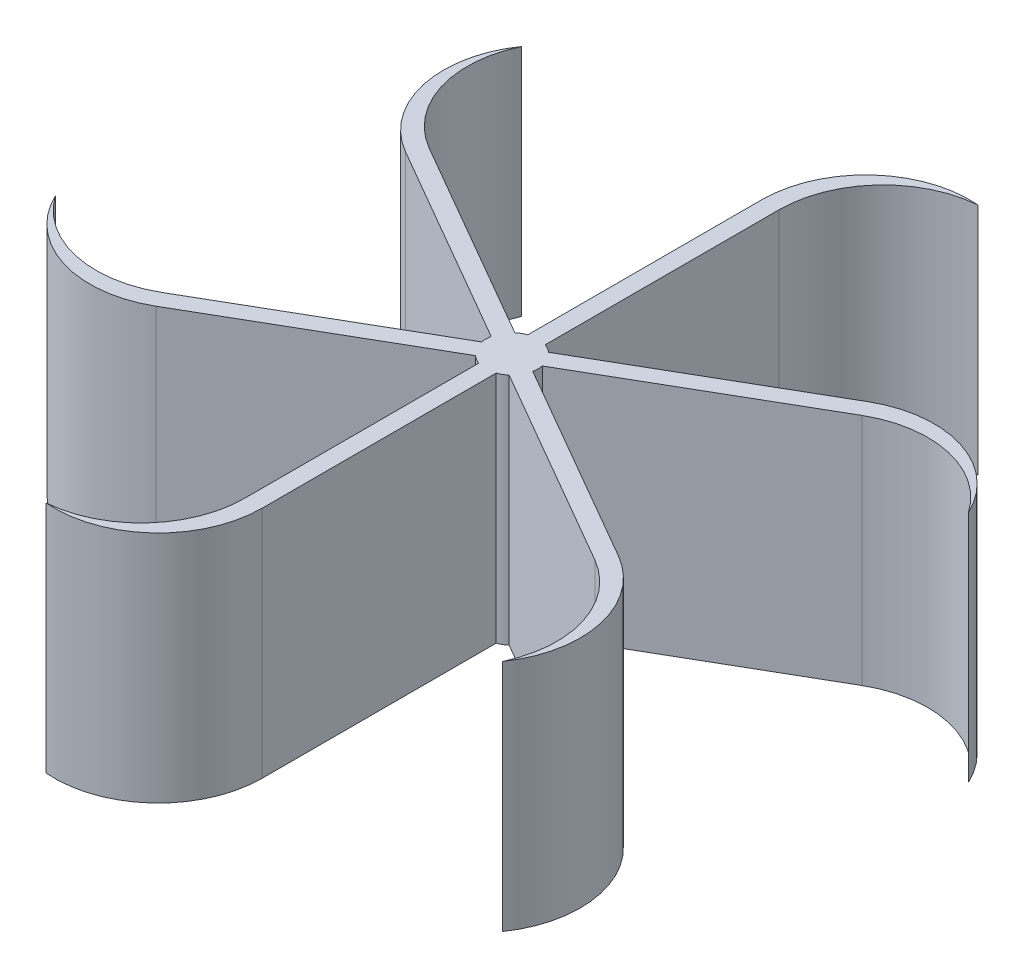
ISO-10303-21;
HEADER;
FILE_DESCRIPTION(('STEP AP214'),'2;1');
FILE_NAME('part.step','',(''),(''),'','','');
FILE_SCHEMA(('AUTOMOTIVE_DESIGN { 1 0 10303 214 1 1 1 1 }'));
ENDSEC;
DATA;
#1=APPLICATION_CONTEXT('core data for automotive mechanical design processes');
#2=APPLICATION_PROTOCOL_DEFINITION('international standard','automotive_design',2000,#1);
#3=PRODUCT_CONTEXT('',#1,'mechanical');
#4=PRODUCT('Part','Part','',(#3));
#5=PRODUCT_RELATED_PRODUCT_CATEGORY('part','',(#4));
#6=PRODUCT_DEFINITION_FORMATION('','',#4);
#7=PRODUCT_DEFINITION_CONTEXT('part definition',#1,'design');
#8=PRODUCT_DEFINITION('design','',#6,#7);
#9=PRODUCT_DEFINITION_SHAPE('','',#8);
#10=(LENGTH_UNIT() NAMED_UNIT(*) SI_UNIT(.MILLI.,.METRE.));
#11=(NAMED_UNIT(*) PLANE_ANGLE_UNIT() SI_UNIT($,.RADIAN.));
#12=(NAMED_UNIT(*) SI_UNIT($,.STERADIAN.) SOLID_ANGLE_UNIT());
#13=UNCERTAINTY_MEASURE_WITH_UNIT(LENGTH_MEASURE(1.E-05),#10,'distance_accuracy_value','');
#14=(GEOMETRIC_REPRESENTATION_CONTEXT(3) GLOBAL_UNCERTAINTY_ASSIGNED_CONTEXT((#13)) GLOBAL_UNIT_ASSIGNED_CONTEXT((#10,
#11,#12)) REPRESENTATION_CONTEXT('',''));
#15=CARTESIAN_POINT('',(0.,0.,0.));
#16=DIRECTION('',(0.,0.,1.));
#17=DIRECTION('',(1.,0.,0.));
#18=AXIS2_PLACEMENT_3D('',#15,#16,#17);
#19=CARTESIAN_POINT('',(0.,27.,0.));
#20=DIRECTION('',(0.,-1.,0.));
#21=DIRECTION('',(0.,0.,-1.));
#22=AXIS2_PLACEMENT_3D('',#19,#20,#21);
#23=CYLINDRICAL_SURFACE('',#22,3.00000000000001);
#24=CARTESIAN_POINT('',(0.,0.,0.));
#25=DIRECTION('',(0.,1.,0.));
#26=DIRECTION('',(0.,0.,1.));
#27=AXIS2_PLACEMENT_3D('',#24,#25,#26);
#28=CIRCLE('',#27,3.00000000000001);
#29=CARTESIAN_POINT('',(-1.,0.,-2.82842712474619));
#30=VERTEX_POINT('',#29);
#31=CARTESIAN_POINT('',(-1.94948974278315,0.,-2.28023896615756));
#32=VERTEX_POINT('',#31);
#33=EDGE_CURVE('E151',#30,#32,#28,.T.);
#34=ORIENTED_EDGE('',*,*,#33,.T.);
#35=DIRECTION('',(0.,-1.,0.));
#36=VECTOR('',#35,1.);
#37=CARTESIAN_POINT('',(-1.94948974278315,27.,-2.28023896615756));
#38=LINE('',#37,#36);
#39=CARTESIAN_POINT('',(-1.94948974278315,27.,-2.28023896615756));
#40=VERTEX_POINT('',#39);
#41=EDGE_CURVE('E11',#40,#32,#38,.T.);
#42=ORIENTED_EDGE('',*,*,#41,.F.);
#43=CARTESIAN_POINT('',(0.,27.,0.));
#44=DIRECTION('',(0.,1.,0.));
#45=DIRECTION('',(0.,0.,1.));
#46=AXIS2_PLACEMENT_3D('',#43,#44,#45);
#47=CIRCLE('',#46,3.00000000000001);
#48=CARTESIAN_POINT('',(-1.,27.,-2.82842712474619));
#49=VERTEX_POINT('',#48);
#50=EDGE_CURVE('E157',#49,#40,#47,.T.);
#51=ORIENTED_EDGE('',*,*,#50,.F.);
#52=DIRECTION('',(0.,-1.,0.));
#53=VECTOR('',#52,1.);
#54=CARTESIAN_POINT('',(-1.,27.,-2.82842712474619));
#55=LINE('',#54,#53);
#56=EDGE_CURVE('E257',#49,#30,#55,.T.);
#57=ORIENTED_EDGE('',*,*,#56,.T.);
#58=EDGE_LOOP('',(#34,#42,#51,#57));
#59=FACE_BOUND('',#58,.T.);
#60=ADVANCED_FACE('F33',(#59),#23,.T.);
#61=CARTESIAN_POINT('',(-1.94948974278315,27.,-2.28023896615756));
#62=DIRECTION('',(-0.50000000000001,0.,0.866025403784433));
#63=DIRECTION('',(0.866025403784433,0.,0.50000000000001));
#64=AXIS2_PLACEMENT_3D('',#61,#62,#63);
#65=PLANE('',#64);
#66=DIRECTION('',(-0.866025403784433,0.,-0.50000000000001));
#67=VECTOR('',#66,1.);
#68=CARTESIAN_POINT('',(-1.94948974278315,0.,-2.28023896615756));
#69=LINE('',#68,#67);
#70=CARTESIAN_POINT('',(-25.3321756449628,0.,-15.7802389661578));
#71=VERTEX_POINT('',#70);
#72=EDGE_CURVE('E262',#32,#71,#69,.T.);
#73=ORIENTED_EDGE('',*,*,#72,.T.);
#74=DIRECTION('',(0.,-1.,0.));
#75=VECTOR('',#74,1.);
#76=CARTESIAN_POINT('',(-25.3321756449628,27.,-15.7802389661578));
#77=LINE('',#76,#75);
#78=CARTESIAN_POINT('',(-25.3321756449628,27.,-15.7802389661578));
#79=VERTEX_POINT('',#78);
#80=EDGE_CURVE('E41',#79,#71,#77,.T.);
#81=ORIENTED_EDGE('',*,*,#80,.F.);
#82=DIRECTION('',(-0.866025403784433,0.,-0.50000000000001));
#83=VECTOR('',#82,1.);
#84=CARTESIAN_POINT('',(-1.94948974278315,27.,-2.28023896615756));
#85=LINE('',#84,#83);
#86=EDGE_CURVE('E479',#40,#79,#85,.T.);
#87=ORIENTED_EDGE('',*,*,#86,.F.);
#88=ORIENTED_EDGE('',*,*,#41,.T.);
#89=EDGE_LOOP('',(#73,#81,#87,#88));
#90=FACE_BOUND('',#89,.T.);
#91=ADVANCED_FACE('F482',(#90),#65,.F.);
#92=CARTESIAN_POINT('',(-19.3321756449627,27.,-26.172543811571));
#93=DIRECTION('',(0.,-1.,0.));
#94=DIRECTION('',(0.,0.,-1.));
#95=AXIS2_PLACEMENT_3D('',#92,#93,#94);
#96=CYLINDRICAL_SURFACE('',#95,12.);
#97=CARTESIAN_POINT('',(-19.3321756449627,0.,-26.172543811571));
#98=DIRECTION('',(0.,-1.,0.));
#99=DIRECTION('',(0.,0.,-1.));
#100=AXIS2_PLACEMENT_3D('',#97,#98,#99);
#101=CIRCLE('',#100,12.);
#102=CARTESIAN_POINT('',(-30.1883332335666,0.,-31.2856487793374));
#103=VERTEX_POINT('',#102);
#104=EDGE_CURVE('E264',#71,#103,#101,.T.);
#105=ORIENTED_EDGE('',*,*,#104,.T.);
#106=DIRECTION('',(0.,-1.,0.));
#107=VECTOR('',#106,1.);
#108=CARTESIAN_POINT('',(-30.1883332335666,27.,-31.2856487793374));
#109=LINE('',#108,#107);
#110=CARTESIAN_POINT('',(-30.1883332335666,27.,-31.2856487793374));
#111=VERTEX_POINT('',#110);
#112=EDGE_CURVE('E396',#111,#103,#109,.T.);
#113=ORIENTED_EDGE('',*,*,#112,.F.);
#114=CARTESIAN_POINT('',(-19.3321756449627,27.,-26.172543811571));
#115=DIRECTION('',(0.,-1.,0.));
#116=DIRECTION('',(0.,0.,-1.));
#117=AXIS2_PLACEMENT_3D('',#114,#115,#116);
#118=CIRCLE('',#117,12.);
#119=EDGE_CURVE('E405',#79,#111,#118,.T.);
#120=ORIENTED_EDGE('',*,*,#119,.F.);
#121=ORIENTED_EDGE('',*,*,#80,.T.);
#122=EDGE_LOOP('',(#105,#113,#120,#121));
#123=FACE_BOUND('',#122,.T.);
#124=ADVANCED_FACE('F403',(#123),#96,.F.);
#125=CARTESIAN_POINT('',(-20.3321756449627,27.,-24.4404930040022));
#126=DIRECTION('',(0.,-1.,0.));
#127=DIRECTION('',(0.,0.,-1.));
#128=AXIS2_PLACEMENT_3D('',#125,#126,#127);
#129=CYLINDRICAL_SURFACE('',#128,12.);
#130=CARTESIAN_POINT('',(-20.3321756449627,0.,-24.4404930040022));
#131=DIRECTION('',(0.,1.,0.));
#132=DIRECTION('',(0.,0.,-1.));
#133=AXIS2_PLACEMENT_3D('',#130,#131,#132);
#134=CIRCLE('',#133,12.);
#135=CARTESIAN_POINT('',(-26.3321756449629,0.,-14.048188158589));
#136=VERTEX_POINT('',#135);
#137=EDGE_CURVE('E266',#103,#136,#134,.T.);
#138=ORIENTED_EDGE('',*,*,#137,.T.);
#139=DIRECTION('',(0.,-1.,0.));
#140=VECTOR('',#139,1.);
#141=CARTESIAN_POINT('',(-26.3321756449629,27.,-14.048188158589));
#142=LINE('',#141,#140);
#143=CARTESIAN_POINT('',(-26.3321756449629,27.,-14.048188158589));
#144=VERTEX_POINT('',#143);
#145=EDGE_CURVE('E393',#144,#136,#142,.T.);
#146=ORIENTED_EDGE('',*,*,#145,.F.);
#147=CARTESIAN_POINT('',(-20.3321756449627,27.,-24.4404930040022));
#148=DIRECTION('',(0.,1.,0.));
#149=DIRECTION('',(0.,0.,-1.));
#150=AXIS2_PLACEMENT_3D('',#147,#148,#149);
#151=CIRCLE('',#150,12.);
#152=EDGE_CURVE('E422',#111,#144,#151,.T.);
#153=ORIENTED_EDGE('',*,*,#152,.F.);
#154=ORIENTED_EDGE('',*,*,#112,.T.);
#155=EDGE_LOOP('',(#138,#146,#153,#154));
#156=FACE_BOUND('',#155,.T.);
#157=ADVANCED_FACE('F413',(#156),#129,.T.);
#158=CARTESIAN_POINT('',(-2.94948974278317,27.,-0.548188158588691));
#159=DIRECTION('',(0.50000000000001,0.,-0.866025403784433));
#160=DIRECTION('',(-0.866025403784433,0.,-0.50000000000001));
#161=AXIS2_PLACEMENT_3D('',#158,#159,#160);
#162=PLANE('',#161);
#163=DIRECTION('',(0.866025403784433,0.,0.50000000000001));
#164=VECTOR('',#163,1.);
#165=CARTESIAN_POINT('',(-2.94948974278317,0.,-0.548188158588691));
#166=LINE('',#165,#164);
#167=CARTESIAN_POINT('',(-2.94948974278317,0.,-0.548188158588692));
#168=VERTEX_POINT('',#167);
#169=EDGE_CURVE('E268',#136,#168,#166,.T.);
#170=ORIENTED_EDGE('',*,*,#169,.T.);
#171=DIRECTION('',(0.,-1.,0.));
#172=VECTOR('',#171,1.);
#173=CARTESIAN_POINT('',(-2.94948974278317,27.,-0.548188158588692));
#174=LINE('',#173,#172);
#175=CARTESIAN_POINT('',(-2.94948974278317,27.,-0.548188158588692));
#176=VERTEX_POINT('',#175);
#177=EDGE_CURVE('E390',#176,#168,#174,.T.);
#178=ORIENTED_EDGE('',*,*,#177,.F.);
#179=DIRECTION('',(0.866025403784433,0.,0.50000000000001));
#180=VECTOR('',#179,1.);
#181=CARTESIAN_POINT('',(-2.94948974278317,27.,-0.548188158588691));
#182=LINE('',#181,#180);
#183=EDGE_CURVE('E419',#144,#176,#182,.T.);
#184=ORIENTED_EDGE('',*,*,#183,.F.);
#185=ORIENTED_EDGE('',*,*,#145,.T.);
#186=EDGE_LOOP('',(#170,#178,#184,#185));
#187=FACE_BOUND('',#186,.T.);
#188=ADVANCED_FACE('F417',(#187),#162,.F.);
#189=CARTESIAN_POINT('',(0.,27.,0.));
#190=DIRECTION('',(0.,-1.,0.));
#191=DIRECTION('',(0.,0.,-1.));
#192=AXIS2_PLACEMENT_3D('',#189,#190,#191);
#193=CYLINDRICAL_SURFACE('',#192,3.);
#194=CARTESIAN_POINT('',(0.,0.,0.));
#195=DIRECTION('',(0.,1.,0.));
#196=DIRECTION('',(0.,0.,1.));
#197=AXIS2_PLACEMENT_3D('',#194,#195,#196);
#198=CIRCLE('',#197,3.);
#199=CARTESIAN_POINT('',(-2.94948974278318,0.,0.548188158588629));
#200=VERTEX_POINT('',#199);
#201=EDGE_CURVE('E271',#168,#200,#198,.T.);
#202=ORIENTED_EDGE('',*,*,#201,.T.);
#203=DIRECTION('',(0.,-1.,0.));
#204=VECTOR('',#203,1.);
#205=CARTESIAN_POINT('',(-2.94948974278318,27.,0.548188158588629));
#206=LINE('',#205,#204);
#207=CARTESIAN_POINT('',(-2.94948974278318,27.,0.548188158588629));
#208=VERTEX_POINT('',#207);
#209=EDGE_CURVE('E387',#208,#200,#206,.T.);
#210=ORIENTED_EDGE('',*,*,#209,.F.);
#211=CARTESIAN_POINT('',(0.,27.,0.));
#212=DIRECTION('',(0.,1.,0.));
#213=DIRECTION('',(0.,0.,1.));
#214=AXIS2_PLACEMENT_3D('',#211,#212,#213);
#215=CIRCLE('',#214,3.);
#216=EDGE_CURVE('E421',#176,#208,#215,.T.);
#217=ORIENTED_EDGE('',*,*,#216,.F.);
#218=ORIENTED_EDGE('',*,*,#177,.T.);
#219=EDGE_LOOP('',(#202,#210,#217,#218));
#220=FACE_BOUND('',#219,.T.);
#221=ADVANCED_FACE('F494',(#220),#193,.T.);
#222=CARTESIAN_POINT('',(-2.94948974278318,27.,0.548188158588629));
#223=DIRECTION('',(0.499999999999992,0.,0.866025403784443));
#224=DIRECTION('',(0.866025403784443,0.,-0.499999999999992));
#225=AXIS2_PLACEMENT_3D('',#222,#223,#224);
#226=PLANE('',#225);
#227=DIRECTION('',(-0.866025403784443,0.,0.499999999999992));
#228=VECTOR('',#227,1.);
#229=CARTESIAN_POINT('',(-2.94948974278318,0.,0.548188158588629));
#230=LINE('',#229,#228);
#231=CARTESIAN_POINT('',(-26.3321756449632,0.,14.0481881585884));
#232=VERTEX_POINT('',#231);
#233=EDGE_CURVE('E273',#200,#232,#230,.T.);
#234=ORIENTED_EDGE('',*,*,#233,.T.);
#235=DIRECTION('',(0.,-1.,0.));
#236=VECTOR('',#235,1.);
#237=CARTESIAN_POINT('',(-26.3321756449632,27.,14.0481881585884));
#238=LINE('',#237,#236);
#239=CARTESIAN_POINT('',(-26.3321756449632,27.,14.0481881585884));
#240=VERTEX_POINT('',#239);
#241=EDGE_CURVE('E384',#240,#232,#238,.T.);
#242=ORIENTED_EDGE('',*,*,#241,.F.);
#243=DIRECTION('',(-0.866025403784443,0.,0.499999999999992));
#244=VECTOR('',#243,1.);
#245=CARTESIAN_POINT('',(-2.94948974278318,27.,0.548188158588629));
#246=LINE('',#245,#244);
#247=EDGE_CURVE('E424',#208,#240,#246,.T.);
#248=ORIENTED_EDGE('',*,*,#247,.F.);
#249=ORIENTED_EDGE('',*,*,#209,.T.);
#250=EDGE_LOOP('',(#234,#242,#248,#249));
#251=FACE_BOUND('',#250,.T.);
#252=ADVANCED_FACE('F497',(#251),#226,.F.);
#253=CARTESIAN_POINT('',(-32.3321756449631,27.,3.65588331317509));
#254=DIRECTION('',(0.,-1.,0.));
#255=DIRECTION('',(0.,0.,-1.));
#256=AXIS2_PLACEMENT_3D('',#253,#254,#255);
#257=CYLINDRICAL_SURFACE('',#256,12.);
#258=CARTESIAN_POINT('',(-32.3321756449631,0.,3.65588331317509));
#259=DIRECTION('',(0.,-1.,0.));
#260=DIRECTION('',(0.,0.,-1.));
#261=AXIS2_PLACEMENT_3D('',#258,#259,#260);
#262=CIRCLE('',#261,12.);
#263=CARTESIAN_POINT('',(-42.1883332335671,0.,10.5010390885101));
#264=VERTEX_POINT('',#263);
#265=EDGE_CURVE('E275',#232,#264,#262,.T.);
#266=ORIENTED_EDGE('',*,*,#265,.T.);
#267=DIRECTION('',(0.,-1.,0.));
#268=VECTOR('',#267,1.);
#269=CARTESIAN_POINT('',(-42.1883332335671,27.,10.5010390885101));
#270=LINE('',#269,#268);
#271=CARTESIAN_POINT('',(-42.1883332335671,27.,10.5010390885101));
#272=VERTEX_POINT('',#271);
#273=EDGE_CURVE('E381',#272,#264,#270,.T.);
#274=ORIENTED_EDGE('',*,*,#273,.F.);
#275=CARTESIAN_POINT('',(-32.3321756449631,27.,3.65588331317509));
#276=DIRECTION('',(0.,-1.,0.));
#277=DIRECTION('',(0.,0.,-1.));
#278=AXIS2_PLACEMENT_3D('',#275,#276,#277);
#279=CIRCLE('',#278,12.);
#280=EDGE_CURVE('E430',#240,#272,#279,.T.);
#281=ORIENTED_EDGE('',*,*,#280,.F.);
#282=ORIENTED_EDGE('',*,*,#241,.T.);
#283=EDGE_LOOP('',(#266,#274,#281,#282));
#284=FACE_BOUND('',#283,.T.);
#285=ADVANCED_FACE('F501',(#284),#257,.F.);
#286=CARTESIAN_POINT('',(-31.3321756449631,27.,5.38793412074398));
#287=DIRECTION('',(0.,-1.,0.));
#288=DIRECTION('',(0.,0.,-1.));
#289=AXIS2_PLACEMENT_3D('',#286,#287,#288);
#290=CYLINDRICAL_SURFACE('',#289,12.);
#291=CARTESIAN_POINT('',(-31.3321756449631,0.,5.38793412074398));
#292=DIRECTION('',(0.,1.,0.));
#293=DIRECTION('',(0.,0.,-1.));
#294=AXIS2_PLACEMENT_3D('',#291,#292,#293);
#295=CIRCLE('',#294,12.);
#296=CARTESIAN_POINT('',(-25.3321756449632,0.,15.7802389661573));
#297=VERTEX_POINT('',#296);
#298=EDGE_CURVE('E277',#264,#297,#295,.T.);
#299=ORIENTED_EDGE('',*,*,#298,.T.);
#300=DIRECTION('',(0.,-1.,0.));
#301=VECTOR('',#300,1.);
#302=CARTESIAN_POINT('',(-25.3321756449632,27.,15.7802389661573));
#303=LINE('',#302,#301);
#304=CARTESIAN_POINT('',(-25.3321756449632,27.,15.7802389661573));
#305=VERTEX_POINT('',#304);
#306=EDGE_CURVE('E378',#305,#297,#303,.T.);
#307=ORIENTED_EDGE('',*,*,#306,.F.);
#308=CARTESIAN_POINT('',(-31.3321756449631,27.,5.38793412074398));
#309=DIRECTION('',(0.,1.,0.));
#310=DIRECTION('',(0.,0.,-1.));
#311=AXIS2_PLACEMENT_3D('',#308,#309,#310);
#312=CIRCLE('',#311,12.);
#313=EDGE_CURVE('E432',#272,#305,#312,.T.);
#314=ORIENTED_EDGE('',*,*,#313,.F.);
#315=ORIENTED_EDGE('',*,*,#273,.T.);
#316=EDGE_LOOP('',(#299,#307,#314,#315));
#317=FACE_BOUND('',#316,.T.);
#318=ADVANCED_FACE('F505',(#317),#290,.T.);
#319=CARTESIAN_POINT('',(-1.9494897427832,27.,2.28023896615752));
#320=DIRECTION('',(-0.499999999999992,0.,-0.866025403784443));
#321=DIRECTION('',(-0.866025403784443,0.,0.499999999999992));
#322=AXIS2_PLACEMENT_3D('',#319,#320,#321);
#323=PLANE('',#322);
#324=DIRECTION('',(0.866025403784443,0.,-0.499999999999992));
#325=VECTOR('',#324,1.);
#326=CARTESIAN_POINT('',(-1.9494897427832,0.,2.28023896615752));
#327=LINE('',#326,#325);
#328=CARTESIAN_POINT('',(-1.9494897427832,0.,2.28023896615751));
#329=VERTEX_POINT('',#328);
#330=EDGE_CURVE('E279',#297,#329,#327,.T.);
#331=ORIENTED_EDGE('',*,*,#330,.T.);
#332=DIRECTION('',(0.,-1.,0.));
#333=VECTOR('',#332,1.);
#334=CARTESIAN_POINT('',(-1.9494897427832,27.,2.28023896615751));
#335=LINE('',#334,#333);
#336=CARTESIAN_POINT('',(-1.9494897427832,27.,2.28023896615751));
#337=VERTEX_POINT('',#336);
#338=EDGE_CURVE('E375',#337,#329,#335,.T.);
#339=ORIENTED_EDGE('',*,*,#338,.F.);
#340=DIRECTION('',(0.866025403784443,0.,-0.499999999999992));
#341=VECTOR('',#340,1.);
#342=CARTESIAN_POINT('',(-1.9494897427832,27.,2.28023896615752));
#343=LINE('',#342,#341);
#344=EDGE_CURVE('E434',#305,#337,#343,.T.);
#345=ORIENTED_EDGE('',*,*,#344,.F.);
#346=ORIENTED_EDGE('',*,*,#306,.T.);
#347=EDGE_LOOP('',(#331,#339,#345,#346));
#348=FACE_BOUND('',#347,.T.);
#349=ADVANCED_FACE('F509',(#348),#323,.F.);
#350=CARTESIAN_POINT('',(0.,27.,0.));
#351=DIRECTION('',(0.,-1.,0.));
#352=DIRECTION('',(0.,0.,-1.));
#353=AXIS2_PLACEMENT_3D('',#350,#351,#352);
#354=CYLINDRICAL_SURFACE('',#353,3.);
#355=CARTESIAN_POINT('',(0.,0.,0.));
#356=DIRECTION('',(0.,1.,0.));
#357=DIRECTION('',(0.,0.,1.));
#358=AXIS2_PLACEMENT_3D('',#355,#356,#357);
#359=CIRCLE('',#358,3.);
#360=CARTESIAN_POINT('',(-1.00000000000002,0.,2.82842712474618));
#361=VERTEX_POINT('',#360);
#362=EDGE_CURVE('E282',#329,#361,#359,.T.);
#363=ORIENTED_EDGE('',*,*,#362,.T.);
#364=DIRECTION('',(0.,-1.,0.));
#365=VECTOR('',#364,1.);
#366=CARTESIAN_POINT('',(-1.00000000000002,27.,2.82842712474618));
#367=LINE('',#366,#365);
#368=CARTESIAN_POINT('',(-1.00000000000002,27.,2.82842712474618));
#369=VERTEX_POINT('',#368);
#370=EDGE_CURVE('E372',#369,#361,#367,.T.);
#371=ORIENTED_EDGE('',*,*,#370,.F.);
#372=CARTESIAN_POINT('',(0.,27.,0.));
#373=DIRECTION('',(0.,1.,0.));
#374=DIRECTION('',(0.,0.,1.));
#375=AXIS2_PLACEMENT_3D('',#372,#373,#374);
#376=CIRCLE('',#375,3.);
#377=EDGE_CURVE('E436',#337,#369,#376,.T.);
#378=ORIENTED_EDGE('',*,*,#377,.F.);
#379=ORIENTED_EDGE('',*,*,#338,.T.);
#380=EDGE_LOOP('',(#363,#371,#378,#379));
#381=FACE_BOUND('',#380,.T.);
#382=ADVANCED_FACE('F513',(#381),#354,.T.);
#383=CARTESIAN_POINT('',(-1.00000000000002,27.,2.82842712474618));
#384=DIRECTION('',(1.,0.,0.));
#385=DIRECTION('',(0.,0.,-1.));
#386=AXIS2_PLACEMENT_3D('',#383,#384,#385);
#387=PLANE('',#386);
#388=DIRECTION('',(0.,0.,1.));
#389=VECTOR('',#388,1.);
#390=CARTESIAN_POINT('',(-1.00000000000002,0.,2.82842712474618));
#391=LINE('',#390,#389);
#392=CARTESIAN_POINT('',(-1.00000000000021,0.,29.8284271247462));
#393=VERTEX_POINT('',#392);
#394=EDGE_CURVE('E284',#361,#393,#391,.T.);
#395=ORIENTED_EDGE('',*,*,#394,.T.);
#396=DIRECTION('',(0.,-1.,0.));
#397=VECTOR('',#396,1.);
#398=CARTESIAN_POINT('',(-1.00000000000021,27.,29.8284271247462));
#399=LINE('',#398,#397);
#400=CARTESIAN_POINT('',(-1.00000000000021,27.,29.8284271247462));
#401=VERTEX_POINT('',#400);
#402=EDGE_CURVE('E369',#401,#393,#399,.T.);
#403=ORIENTED_EDGE('',*,*,#402,.F.);
#404=DIRECTION('',(0.,0.,1.));
#405=VECTOR('',#404,1.);
#406=CARTESIAN_POINT('',(-1.00000000000002,27.,2.82842712474618));
#407=LINE('',#406,#405);
#408=EDGE_CURVE('E438',#369,#401,#407,.T.);
#409=ORIENTED_EDGE('',*,*,#408,.F.);
#410=ORIENTED_EDGE('',*,*,#370,.T.);
#411=EDGE_LOOP('',(#395,#403,#409,#410));
#412=FACE_BOUND('',#411,.T.);
#413=ADVANCED_FACE('F517',(#412),#387,.F.);
#414=CARTESIAN_POINT('',(-13.0000000000002,27.,29.8284271247461));
#415=DIRECTION('',(0.,-1.,0.));
#416=DIRECTION('',(0.,0.,-1.));
#417=AXIS2_PLACEMENT_3D('',#414,#415,#416);
#418=CYLINDRICAL_SURFACE('',#417,12.);
#419=CARTESIAN_POINT('',(-13.0000000000002,0.,29.8284271247461));
#420=DIRECTION('',(0.,-1.,0.));
#421=DIRECTION('',(0.,0.,-1.));
#422=AXIS2_PLACEMENT_3D('',#419,#420,#421);
#423=CIRCLE('',#422,12.);
#424=CARTESIAN_POINT('',(-12.0000000000003,0.,41.7866878678475));
#425=VERTEX_POINT('',#424);
#426=EDGE_CURVE('E286',#393,#425,#423,.T.);
#427=ORIENTED_EDGE('',*,*,#426,.T.);
#428=DIRECTION('',(0.,-1.,0.));
#429=VECTOR('',#428,1.);
#430=CARTESIAN_POINT('',(-12.0000000000003,27.,41.7866878678475));
#431=LINE('',#430,#429);
#432=CARTESIAN_POINT('',(-12.0000000000003,27.,41.7866878678475));
#433=VERTEX_POINT('',#432);
#434=EDGE_CURVE('E366',#433,#425,#431,.T.);
#435=ORIENTED_EDGE('',*,*,#434,.F.);
#436=CARTESIAN_POINT('',(-13.0000000000002,27.,29.8284271247461));
#437=DIRECTION('',(0.,-1.,0.));
#438=DIRECTION('',(0.,0.,-1.));
#439=AXIS2_PLACEMENT_3D('',#436,#437,#438);
#440=CIRCLE('',#439,12.);
#441=EDGE_CURVE('E440',#401,#433,#440,.T.);
#442=ORIENTED_EDGE('',*,*,#441,.F.);
#443=ORIENTED_EDGE('',*,*,#402,.T.);
#444=EDGE_LOOP('',(#427,#435,#442,#443));
#445=FACE_BOUND('',#444,.T.);
#446=ADVANCED_FACE('F521',(#445),#418,.F.);
#447=CARTESIAN_POINT('',(-11.0000000000002,27.,29.8284271247461));
#448=DIRECTION('',(0.,-1.,0.));
#449=DIRECTION('',(0.,0.,-1.));
#450=AXIS2_PLACEMENT_3D('',#447,#448,#449);
#451=CYLINDRICAL_SURFACE('',#450,12.);
#452=CARTESIAN_POINT('',(-11.0000000000002,0.,29.8284271247461));
#453=DIRECTION('',(0.,1.,0.));
#454=DIRECTION('',(0.,0.,-1.));
#455=AXIS2_PLACEMENT_3D('',#452,#453,#454);
#456=CIRCLE('',#455,12.);
#457=CARTESIAN_POINT('',(0.999999999999792,0.,29.8284271247462));
#458=VERTEX_POINT('',#457);
#459=EDGE_CURVE('E288',#425,#458,#456,.T.);
#460=ORIENTED_EDGE('',*,*,#459,.T.);
#461=DIRECTION('',(0.,-1.,0.));
#462=VECTOR('',#461,1.);
#463=CARTESIAN_POINT('',(0.999999999999792,27.,29.8284271247462));
#464=LINE('',#463,#462);
#465=CARTESIAN_POINT('',(0.999999999999792,27.,29.8284271247462));
#466=VERTEX_POINT('',#465);
#467=EDGE_CURVE('E363',#466,#458,#464,.T.);
#468=ORIENTED_EDGE('',*,*,#467,.F.);
#469=CARTESIAN_POINT('',(-11.0000000000002,27.,29.8284271247461));
#470=DIRECTION('',(0.,1.,0.));
#471=DIRECTION('',(0.,0.,-1.));
#472=AXIS2_PLACEMENT_3D('',#469,#470,#471);
#473=CIRCLE('',#472,12.);
#474=EDGE_CURVE('E442',#433,#466,#473,.T.);
#475=ORIENTED_EDGE('',*,*,#474,.F.);
#476=ORIENTED_EDGE('',*,*,#434,.T.);
#477=EDGE_LOOP('',(#460,#468,#475,#476));
#478=FACE_BOUND('',#477,.T.);
#479=ADVANCED_FACE('F525',(#478),#451,.T.);
#480=CARTESIAN_POINT('',(0.999999999999981,27.,2.8284271247462));
#481=DIRECTION('',(-1.,0.,0.));
#482=DIRECTION('',(0.,0.,1.));
#483=AXIS2_PLACEMENT_3D('',#480,#481,#482);
#484=PLANE('',#483);
#485=DIRECTION('',(0.,0.,-1.));
#486=VECTOR('',#485,1.);
#487=CARTESIAN_POINT('',(0.999999999999981,0.,2.8284271247462));
#488=LINE('',#487,#486);
#489=CARTESIAN_POINT('',(0.999999999999981,0.,2.8284271247462));
#490=VERTEX_POINT('',#489);
#491=EDGE_CURVE('E290',#458,#490,#488,.T.);
#492=ORIENTED_EDGE('',*,*,#491,.T.);
#493=DIRECTION('',(0.,-1.,0.));
#494=VECTOR('',#493,1.);
#495=CARTESIAN_POINT('',(0.999999999999981,27.,2.8284271247462));
#496=LINE('',#495,#494);
#497=CARTESIAN_POINT('',(0.999999999999981,27.,2.8284271247462));
#498=VERTEX_POINT('',#497);
#499=EDGE_CURVE('E360',#498,#490,#496,.T.);
#500=ORIENTED_EDGE('',*,*,#499,.F.);
#501=DIRECTION('',(0.,0.,-1.));
#502=VECTOR('',#501,1.);
#503=CARTESIAN_POINT('',(0.999999999999981,27.,2.8284271247462));
#504=LINE('',#503,#502);
#505=EDGE_CURVE('E444',#466,#498,#504,.T.);
#506=ORIENTED_EDGE('',*,*,#505,.F.);
#507=ORIENTED_EDGE('',*,*,#467,.T.);
#508=EDGE_LOOP('',(#492,#500,#506,#507));
#509=FACE_BOUND('',#508,.T.);
#510=ADVANCED_FACE('F529',(#509),#484,.F.);
#511=CARTESIAN_POINT('',(0.,27.,0.));
#512=DIRECTION('',(0.,-1.,0.));
#513=DIRECTION('',(0.,0.,-1.));
#514=AXIS2_PLACEMENT_3D('',#511,#512,#513);
#515=CYLINDRICAL_SURFACE('',#514,3.);
#516=CARTESIAN_POINT('',(0.,0.,0.));
#517=DIRECTION('',(0.,1.,0.));
#518=DIRECTION('',(0.,0.,1.));
#519=AXIS2_PLACEMENT_3D('',#516,#517,#518);
#520=CIRCLE('',#519,3.);
#521=CARTESIAN_POINT('',(1.94948974278317,0.,2.28023896615754));
#522=VERTEX_POINT('',#521);
#523=EDGE_CURVE('E293',#490,#522,#520,.T.);
#524=ORIENTED_EDGE('',*,*,#523,.T.);
#525=DIRECTION('',(0.,-1.,0.));
#526=VECTOR('',#525,1.);
#527=CARTESIAN_POINT('',(1.94948974278317,27.,2.28023896615754));
#528=LINE('',#527,#526);
#529=CARTESIAN_POINT('',(1.94948974278317,27.,2.28023896615754));
#530=VERTEX_POINT('',#529);
#531=EDGE_CURVE('E357',#530,#522,#528,.T.);
#532=ORIENTED_EDGE('',*,*,#531,.F.);
#533=CARTESIAN_POINT('',(0.,27.,0.));
#534=DIRECTION('',(0.,1.,0.));
#535=DIRECTION('',(0.,0.,1.));
#536=AXIS2_PLACEMENT_3D('',#533,#534,#535);
#537=CIRCLE('',#536,3.);
#538=EDGE_CURVE('E446',#498,#530,#537,.T.);
#539=ORIENTED_EDGE('',*,*,#538,.F.);
#540=ORIENTED_EDGE('',*,*,#499,.T.);
#541=EDGE_LOOP('',(#524,#532,#539,#540));
#542=FACE_BOUND('',#541,.T.);
#543=ADVANCED_FACE('F533',(#542),#515,.T.);
#544=CARTESIAN_POINT('',(1.94948974278317,27.,2.28023896615754));
#545=DIRECTION('',(0.500000000000004,0.,-0.866025403784436));
#546=DIRECTION('',(-0.866025403784436,0.,-0.500000000000004));
#547=AXIS2_PLACEMENT_3D('',#544,#545,#546);
#548=PLANE('',#547);
#549=DIRECTION('',(0.866025403784436,0.,0.500000000000004));
#550=VECTOR('',#549,1.);
#551=CARTESIAN_POINT('',(1.94948974278317,0.,2.28023896615754));
#552=LINE('',#551,#550);
#553=CARTESIAN_POINT('',(25.332175644963,0.,15.7802389661577));
#554=VERTEX_POINT('',#553);
#555=EDGE_CURVE('E295',#522,#554,#552,.T.);
#556=ORIENTED_EDGE('',*,*,#555,.T.);
#557=DIRECTION('',(0.,-1.,0.));
#558=VECTOR('',#557,1.);
#559=CARTESIAN_POINT('',(25.332175644963,27.,15.7802389661577));
#560=LINE('',#559,#558);
#561=CARTESIAN_POINT('',(25.332175644963,27.,15.7802389661577));
#562=VERTEX_POINT('',#561);
#563=EDGE_CURVE('E354',#562,#554,#560,.T.);
#564=ORIENTED_EDGE('',*,*,#563,.F.);
#565=DIRECTION('',(0.866025403784436,0.,0.500000000000004));
#566=VECTOR('',#565,1.);
#567=CARTESIAN_POINT('',(1.94948974278317,27.,2.28023896615754));
#568=LINE('',#567,#566);
#569=EDGE_CURVE('E448',#530,#562,#568,.T.);
#570=ORIENTED_EDGE('',*,*,#569,.F.);
#571=ORIENTED_EDGE('',*,*,#531,.T.);
#572=EDGE_LOOP('',(#556,#564,#570,#571));
#573=FACE_BOUND('',#572,.T.);
#574=ADVANCED_FACE('F537',(#573),#548,.F.);
#575=CARTESIAN_POINT('',(19.3321756449629,27.,26.1725438115709));
#576=DIRECTION('',(0.,-1.,0.));
#577=DIRECTION('',(0.,0.,-1.));
#578=AXIS2_PLACEMENT_3D('',#575,#576,#577);
#579=CYLINDRICAL_SURFACE('',#578,12.);
#580=CARTESIAN_POINT('',(19.3321756449629,0.,26.1725438115709));
#581=DIRECTION('',(0.,-1.,0.));
#582=DIRECTION('',(0.,0.,-1.));
#583=AXIS2_PLACEMENT_3D('',#580,#581,#582);
#584=CIRCLE('',#583,12.);
#585=CARTESIAN_POINT('',(30.1883332335669,0.,31.2856487793372));
#586=VERTEX_POINT('',#585);
#587=EDGE_CURVE('E297',#554,#586,#584,.T.);
#588=ORIENTED_EDGE('',*,*,#587,.T.);
#589=DIRECTION('',(0.,-1.,0.));
#590=VECTOR('',#589,1.);
#591=CARTESIAN_POINT('',(30.1883332335669,27.,31.2856487793372));
#592=LINE('',#591,#590);
#593=CARTESIAN_POINT('',(30.1883332335669,27.,31.2856487793372));
#594=VERTEX_POINT('',#593);
#595=EDGE_CURVE('E351',#594,#586,#592,.T.);
#596=ORIENTED_EDGE('',*,*,#595,.F.);
#597=CARTESIAN_POINT('',(19.3321756449629,27.,26.1725438115709));
#598=DIRECTION('',(0.,-1.,0.));
#599=DIRECTION('',(0.,0.,-1.));
#600=AXIS2_PLACEMENT_3D('',#597,#598,#599);
#601=CIRCLE('',#600,12.);
#602=EDGE_CURVE('E450',#562,#594,#601,.T.);
#603=ORIENTED_EDGE('',*,*,#602,.F.);
#604=ORIENTED_EDGE('',*,*,#563,.T.);
#605=EDGE_LOOP('',(#588,#596,#603,#604));
#606=FACE_BOUND('',#605,.T.);
#607=ADVANCED_FACE('F541',(#606),#579,.F.);
#608=CARTESIAN_POINT('',(20.3321756449629,27.,24.440493004002));
#609=DIRECTION('',(0.,-1.,0.));
#610=DIRECTION('',(0.,0.,-1.));
#611=AXIS2_PLACEMENT_3D('',#608,#609,#610);
#612=CYLINDRICAL_SURFACE('',#611,12.);
#613=CARTESIAN_POINT('',(20.3321756449629,0.,24.440493004002));
#614=DIRECTION('',(0.,1.,0.));
#615=DIRECTION('',(0.,0.,-1.));
#616=AXIS2_PLACEMENT_3D('',#613,#614,#615);
#617=CIRCLE('',#616,12.);
#618=CARTESIAN_POINT('',(26.332175644963,0.,14.0481881585888));
#619=VERTEX_POINT('',#618);
#620=EDGE_CURVE('E299',#586,#619,#617,.T.);
#621=ORIENTED_EDGE('',*,*,#620,.T.);
#622=DIRECTION('',(0.,-1.,0.));
#623=VECTOR('',#622,1.);
#624=CARTESIAN_POINT('',(26.332175644963,27.,14.0481881585888));
#625=LINE('',#624,#623);
#626=CARTESIAN_POINT('',(26.332175644963,27.,14.0481881585888));
#627=VERTEX_POINT('',#626);
#628=EDGE_CURVE('E348',#627,#619,#625,.T.);
#629=ORIENTED_EDGE('',*,*,#628,.F.);
#630=CARTESIAN_POINT('',(20.3321756449629,27.,24.440493004002));
#631=DIRECTION('',(0.,1.,0.));
#632=DIRECTION('',(0.,0.,-1.));
#633=AXIS2_PLACEMENT_3D('',#630,#631,#632);
#634=CIRCLE('',#633,12.);
#635=EDGE_CURVE('E452',#594,#627,#634,.T.);
#636=ORIENTED_EDGE('',*,*,#635,.F.);
#637=ORIENTED_EDGE('',*,*,#595,.T.);
#638=EDGE_LOOP('',(#621,#629,#636,#637));
#639=FACE_BOUND('',#638,.T.);
#640=ADVANCED_FACE('F545',(#639),#612,.T.);
#641=CARTESIAN_POINT('',(2.94948974278318,27.,0.54818815858867));
#642=DIRECTION('',(-0.500000000000004,0.,0.866025403784436));
#643=DIRECTION('',(0.866025403784436,0.,0.500000000000004));
#644=AXIS2_PLACEMENT_3D('',#641,#642,#643);
#645=PLANE('',#644);
#646=DIRECTION('',(-0.866025403784436,0.,-0.500000000000004));
#647=VECTOR('',#646,1.);
#648=CARTESIAN_POINT('',(2.94948974278318,0.,0.54818815858867));
#649=LINE('',#648,#647);
#650=CARTESIAN_POINT('',(2.94948974278319,0.,0.548188158588672));
#651=VERTEX_POINT('',#650);
#652=EDGE_CURVE('E301',#619,#651,#649,.T.);
#653=ORIENTED_EDGE('',*,*,#652,.T.);
#654=DIRECTION('',(0.,-1.,0.));
#655=VECTOR('',#654,1.);
#656=CARTESIAN_POINT('',(2.94948974278319,27.,0.548188158588672));
#657=LINE('',#656,#655);
#658=CARTESIAN_POINT('',(2.94948974278319,27.,0.548188158588672));
#659=VERTEX_POINT('',#658);
#660=EDGE_CURVE('E345',#659,#651,#657,.T.);
#661=ORIENTED_EDGE('',*,*,#660,.F.);
#662=DIRECTION('',(-0.866025403784436,0.,-0.500000000000004));
#663=VECTOR('',#662,1.);
#664=CARTESIAN_POINT('',(2.94948974278318,27.,0.54818815858867));
#665=LINE('',#664,#663);
#666=EDGE_CURVE('E454',#627,#659,#665,.T.);
#667=ORIENTED_EDGE('',*,*,#666,.F.);
#668=ORIENTED_EDGE('',*,*,#628,.T.);
#669=EDGE_LOOP('',(#653,#661,#667,#668));
#670=FACE_BOUND('',#669,.T.);
#671=ADVANCED_FACE('F549',(#670),#645,.F.);
#672=CARTESIAN_POINT('',(0.,27.,0.));
#673=DIRECTION('',(0.,-1.,0.));
#674=DIRECTION('',(0.,0.,-1.));
#675=AXIS2_PLACEMENT_3D('',#672,#673,#674);
#676=CYLINDRICAL_SURFACE('',#675,3.00000000000001);
#677=CARTESIAN_POINT('',(0.,0.,0.));
#678=DIRECTION('',(0.,1.,0.));
#679=DIRECTION('',(0.,0.,1.));
#680=AXIS2_PLACEMENT_3D('',#677,#678,#679);
#681=CIRCLE('',#680,3.00000000000001);
#682=CARTESIAN_POINT('',(2.94948974278318,0.,-0.54818815858865));
#683=VERTEX_POINT('',#682);
#684=EDGE_CURVE('E304',#651,#683,#681,.T.);
#685=ORIENTED_EDGE('',*,*,#684,.T.);
#686=DIRECTION('',(0.,-1.,0.));
#687=VECTOR('',#686,1.);
#688=CARTESIAN_POINT('',(2.94948974278318,27.,-0.54818815858865));
#689=LINE('',#688,#687);
#690=CARTESIAN_POINT('',(2.94948974278318,27.,-0.54818815858865));
#691=VERTEX_POINT('',#690);
#692=EDGE_CURVE('E342',#691,#683,#689,.T.);
#693=ORIENTED_EDGE('',*,*,#692,.F.);
#694=CARTESIAN_POINT('',(0.,27.,0.));
#695=DIRECTION('',(0.,1.,0.));
#696=DIRECTION('',(0.,0.,1.));
#697=AXIS2_PLACEMENT_3D('',#694,#695,#696);
#698=CIRCLE('',#697,3.00000000000001);
#699=EDGE_CURVE('E456',#659,#691,#698,.T.);
#700=ORIENTED_EDGE('',*,*,#699,.F.);
#701=ORIENTED_EDGE('',*,*,#660,.T.);
#702=EDGE_LOOP('',(#685,#693,#700,#701));
#703=FACE_BOUND('',#702,.T.);
#704=ADVANCED_FACE('F553',(#703),#676,.T.);
#705=CARTESIAN_POINT('',(2.94948974278318,27.,-0.54818815858865));
#706=DIRECTION('',(-0.499999999999998,0.,-0.86602540378444));
#707=DIRECTION('',(-0.86602540378444,0.,0.499999999999998));
#708=AXIS2_PLACEMENT_3D('',#705,#706,#707);
#709=PLANE('',#708);
#710=DIRECTION('',(0.86602540378444,0.,-0.499999999999998));
#711=VECTOR('',#710,1.);
#712=CARTESIAN_POINT('',(2.94948974278318,0.,-0.54818815858865));
#713=LINE('',#712,#711);
#714=CARTESIAN_POINT('',(26.3321756449631,0.,-14.0481881585886));
#715=VERTEX_POINT('',#714);
#716=EDGE_CURVE('E306',#683,#715,#713,.T.);
#717=ORIENTED_EDGE('',*,*,#716,.T.);
#718=DIRECTION('',(0.,-1.,0.));
#719=VECTOR('',#718,1.);
#720=CARTESIAN_POINT('',(26.3321756449631,27.,-14.0481881585886));
#721=LINE('',#720,#719);
#722=CARTESIAN_POINT('',(26.3321756449631,27.,-14.0481881585886));
#723=VERTEX_POINT('',#722);
#724=EDGE_CURVE('E339',#723,#715,#721,.T.);
#725=ORIENTED_EDGE('',*,*,#724,.F.);
#726=DIRECTION('',(0.86602540378444,0.,-0.499999999999998));
#727=VECTOR('',#726,1.);
#728=CARTESIAN_POINT('',(2.94948974278318,27.,-0.54818815858865));
#729=LINE('',#728,#727);
#730=EDGE_CURVE('E458',#691,#723,#729,.T.);
#731=ORIENTED_EDGE('',*,*,#730,.F.);
#732=ORIENTED_EDGE('',*,*,#692,.T.);
#733=EDGE_LOOP('',(#717,#725,#731,#732));
#734=FACE_BOUND('',#733,.T.);
#735=ADVANCED_FACE('F557',(#734),#709,.F.);
#736=CARTESIAN_POINT('',(32.332175644963,27.,-3.65588331317532));
#737=DIRECTION('',(0.,-1.,0.));
#738=DIRECTION('',(0.,0.,-1.));
#739=AXIS2_PLACEMENT_3D('',#736,#737,#738);
#740=CYLINDRICAL_SURFACE('',#739,12.);
#741=CARTESIAN_POINT('',(32.332175644963,0.,-3.65588331317532));
#742=DIRECTION('',(0.,-1.,0.));
#743=DIRECTION('',(0.,0.,-1.));
#744=AXIS2_PLACEMENT_3D('',#741,#742,#743);
#745=CIRCLE('',#744,12.);
#746=CARTESIAN_POINT('',(42.188333233567,0.,-10.5010390885104));
#747=VERTEX_POINT('',#746);
#748=EDGE_CURVE('E308',#715,#747,#745,.T.);
#749=ORIENTED_EDGE('',*,*,#748,.T.);
#750=DIRECTION('',(0.,-1.,0.));
#751=VECTOR('',#750,1.);
#752=CARTESIAN_POINT('',(42.188333233567,27.,-10.5010390885104));
#753=LINE('',#752,#751);
#754=CARTESIAN_POINT('',(42.188333233567,27.,-10.5010390885104));
#755=VERTEX_POINT('',#754);
#756=EDGE_CURVE('E336',#755,#747,#753,.T.);
#757=ORIENTED_EDGE('',*,*,#756,.F.);
#758=CARTESIAN_POINT('',(32.332175644963,27.,-3.65588331317532));
#759=DIRECTION('',(0.,-1.,0.));
#760=DIRECTION('',(0.,0.,-1.));
#761=AXIS2_PLACEMENT_3D('',#758,#759,#760);
#762=CIRCLE('',#761,12.);
#763=EDGE_CURVE('E460',#723,#755,#762,.T.);
#764=ORIENTED_EDGE('',*,*,#763,.F.);
#765=ORIENTED_EDGE('',*,*,#724,.T.);
#766=EDGE_LOOP('',(#749,#757,#764,#765));
#767=FACE_BOUND('',#766,.T.);
#768=ADVANCED_FACE('F561',(#767),#740,.F.);
#769=CARTESIAN_POINT('',(31.332175644963,27.,-5.3879341207442));
#770=DIRECTION('',(0.,-1.,0.));
#771=DIRECTION('',(0.,0.,-1.));
#772=AXIS2_PLACEMENT_3D('',#769,#770,#771);
#773=CYLINDRICAL_SURFACE('',#772,12.);
#774=CARTESIAN_POINT('',(31.332175644963,0.,-5.3879341207442));
#775=DIRECTION('',(0.,1.,0.));
#776=DIRECTION('',(0.,0.,-1.));
#777=AXIS2_PLACEMENT_3D('',#774,#775,#776);
#778=CIRCLE('',#777,12.);
#779=CARTESIAN_POINT('',(25.3321756449631,0.,-15.7802389661575));
#780=VERTEX_POINT('',#779);
#781=EDGE_CURVE('E310',#747,#780,#778,.T.);
#782=ORIENTED_EDGE('',*,*,#781,.T.);
#783=DIRECTION('',(0.,-1.,0.));
#784=VECTOR('',#783,1.);
#785=CARTESIAN_POINT('',(25.3321756449631,27.,-15.7802389661575));
#786=LINE('',#785,#784);
#787=CARTESIAN_POINT('',(25.3321756449631,27.,-15.7802389661575));
#788=VERTEX_POINT('',#787);
#789=EDGE_CURVE('E333',#788,#780,#786,.T.);
#790=ORIENTED_EDGE('',*,*,#789,.F.);
#791=CARTESIAN_POINT('',(31.332175644963,27.,-5.3879341207442));
#792=DIRECTION('',(0.,1.,0.));
#793=DIRECTION('',(0.,0.,-1.));
#794=AXIS2_PLACEMENT_3D('',#791,#792,#793);
#795=CIRCLE('',#794,12.);
#796=EDGE_CURVE('E462',#755,#788,#795,.T.);
#797=ORIENTED_EDGE('',*,*,#796,.F.);
#798=ORIENTED_EDGE('',*,*,#756,.T.);
#799=EDGE_LOOP('',(#782,#790,#797,#798));
#800=FACE_BOUND('',#799,.T.);
#801=ADVANCED_FACE('F565',(#800),#773,.T.);
#802=CARTESIAN_POINT('',(1.94948974278318,27.,-2.28023896615753));
#803=DIRECTION('',(0.499999999999998,0.,0.86602540378444));
#804=DIRECTION('',(0.86602540378444,0.,-0.499999999999998));
#805=AXIS2_PLACEMENT_3D('',#802,#803,#804);
#806=PLANE('',#805);
#807=DIRECTION('',(-0.86602540378444,0.,0.499999999999998));
#808=VECTOR('',#807,1.);
#809=CARTESIAN_POINT('',(1.94948974278318,0.,-2.28023896615753));
#810=LINE('',#809,#808);
#811=CARTESIAN_POINT('',(1.94948974278319,0.,-2.28023896615754));
#812=VERTEX_POINT('',#811);
#813=EDGE_CURVE('E312',#780,#812,#810,.T.);
#814=ORIENTED_EDGE('',*,*,#813,.T.);
#815=DIRECTION('',(0.,-1.,0.));
#816=VECTOR('',#815,1.);
#817=CARTESIAN_POINT('',(1.94948974278319,27.,-2.28023896615754));
#818=LINE('',#817,#816);
#819=CARTESIAN_POINT('',(1.94948974278319,27.,-2.28023896615754));
#820=VERTEX_POINT('',#819);
#821=EDGE_CURVE('E330',#820,#812,#818,.T.);
#822=ORIENTED_EDGE('',*,*,#821,.F.);
#823=DIRECTION('',(-0.86602540378444,0.,0.499999999999998));
#824=VECTOR('',#823,1.);
#825=CARTESIAN_POINT('',(1.94948974278318,27.,-2.28023896615753));
#826=LINE('',#825,#824);
#827=EDGE_CURVE('E464',#788,#820,#826,.T.);
#828=ORIENTED_EDGE('',*,*,#827,.F.);
#829=ORIENTED_EDGE('',*,*,#789,.T.);
#830=EDGE_LOOP('',(#814,#822,#828,#829));
#831=FACE_BOUND('',#830,.T.);
#832=ADVANCED_FACE('F569',(#831),#806,.F.);
#833=CARTESIAN_POINT('',(0.,27.,0.));
#834=DIRECTION('',(0.,-1.,0.));
#835=DIRECTION('',(0.,0.,-1.));
#836=AXIS2_PLACEMENT_3D('',#833,#834,#835);
#837=CYLINDRICAL_SURFACE('',#836,3.00000000000001);
#838=CARTESIAN_POINT('',(0.,0.,0.));
#839=DIRECTION('',(0.,1.,0.));
#840=DIRECTION('',(0.,0.,1.));
#841=AXIS2_PLACEMENT_3D('',#838,#839,#840);
#842=CIRCLE('',#841,3.00000000000001);
#843=CARTESIAN_POINT('',(1.,0.,-2.82842712474619));
#844=VERTEX_POINT('',#843);
#845=EDGE_CURVE('E315',#812,#844,#842,.T.);
#846=ORIENTED_EDGE('',*,*,#845,.T.);
#847=DIRECTION('',(0.,-1.,0.));
#848=VECTOR('',#847,1.);
#849=CARTESIAN_POINT('',(1.,27.,-2.82842712474619));
#850=LINE('',#849,#848);
#851=CARTESIAN_POINT('',(1.,27.,-2.82842712474619));
#852=VERTEX_POINT('',#851);
#853=EDGE_CURVE('E327',#852,#844,#850,.T.);
#854=ORIENTED_EDGE('',*,*,#853,.F.);
#855=CARTESIAN_POINT('',(0.,27.,0.));
#856=DIRECTION('',(0.,1.,0.));
#857=DIRECTION('',(0.,0.,1.));
#858=AXIS2_PLACEMENT_3D('',#855,#856,#857);
#859=CIRCLE('',#858,3.00000000000001);
#860=EDGE_CURVE('E466',#820,#852,#859,.T.);
#861=ORIENTED_EDGE('',*,*,#860,.F.);
#862=ORIENTED_EDGE('',*,*,#821,.T.);
#863=EDGE_LOOP('',(#846,#854,#861,#862));
#864=FACE_BOUND('',#863,.T.);
#865=ADVANCED_FACE('F472',(#864),#837,.T.);
#866=CARTESIAN_POINT('',(1.,27.,-2.82842712474619));
#867=DIRECTION('',(-1.,0.,0.));
#868=DIRECTION('',(0.,0.,1.));
#869=AXIS2_PLACEMENT_3D('',#866,#867,#868);
#870=PLANE('',#869);
#871=DIRECTION('',(0.,0.,-1.));
#872=VECTOR('',#871,1.);
#873=CARTESIAN_POINT('',(1.,0.,-2.82842712474619));
#874=LINE('',#873,#872);
#875=CARTESIAN_POINT('',(0.999999999999999,0.,-29.8284271247462));
#876=VERTEX_POINT('',#875);
#877=EDGE_CURVE('E317',#844,#876,#874,.T.);
#878=ORIENTED_EDGE('',*,*,#877,.T.);
#879=DIRECTION('',(0.,-1.,0.));
#880=VECTOR('',#879,1.);
#881=CARTESIAN_POINT('',(0.999999999999999,27.,-29.8284271247462));
#882=LINE('',#881,#880);
#883=CARTESIAN_POINT('',(0.999999999999999,27.,-29.8284271247462));
#884=VERTEX_POINT('',#883);
#885=EDGE_CURVE('E252',#884,#876,#882,.T.);
#886=ORIENTED_EDGE('',*,*,#885,.F.);
#887=DIRECTION('',(0.,0.,-1.));
#888=VECTOR('',#887,1.);
#889=CARTESIAN_POINT('',(1.,27.,-2.82842712474619));
#890=LINE('',#889,#888);
#891=EDGE_CURVE('E243',#852,#884,#890,.T.);
#892=ORIENTED_EDGE('',*,*,#891,.F.);
#893=ORIENTED_EDGE('',*,*,#853,.T.);
#894=EDGE_LOOP('',(#878,#886,#892,#893));
#895=FACE_BOUND('',#894,.T.);
#896=ADVANCED_FACE('F475',(#895),#870,.F.);
#897=CARTESIAN_POINT('',(13.,27.,-29.8284271247462));
#898=DIRECTION('',(0.,-1.,0.));
#899=DIRECTION('',(0.,0.,-1.));
#900=AXIS2_PLACEMENT_3D('',#897,#898,#899);
#901=CYLINDRICAL_SURFACE('',#900,12.);
#902=CARTESIAN_POINT('',(13.,0.,-29.8284271247462));
#903=DIRECTION('',(0.,-1.,0.));
#904=DIRECTION('',(0.,0.,-1.));
#905=AXIS2_PLACEMENT_3D('',#902,#903,#904);
#906=CIRCLE('',#905,12.);
#907=CARTESIAN_POINT('',(12.,0.,-41.7866878678476));
#908=VERTEX_POINT('',#907);
#909=EDGE_CURVE('E251',#876,#908,#906,.T.);
#910=ORIENTED_EDGE('',*,*,#909,.T.);
#911=DIRECTION('',(0.,-1.,0.));
#912=VECTOR('',#911,1.);
#913=CARTESIAN_POINT('',(12.,27.,-41.7866878678476));
#914=LINE('',#913,#912);
#915=CARTESIAN_POINT('',(12.,27.,-41.7866878678476));
#916=VERTEX_POINT('',#915);
#917=EDGE_CURVE('E248',#916,#908,#914,.T.);
#918=ORIENTED_EDGE('',*,*,#917,.F.);
#919=CARTESIAN_POINT('',(13.,27.,-29.8284271247462));
#920=DIRECTION('',(0.,-1.,0.));
#921=DIRECTION('',(0.,0.,-1.));
#922=AXIS2_PLACEMENT_3D('',#919,#920,#921);
#923=CIRCLE('',#922,12.);
#924=EDGE_CURVE('E237',#884,#916,#923,.T.);
#925=ORIENTED_EDGE('',*,*,#924,.F.);
#926=ORIENTED_EDGE('',*,*,#885,.T.);
#927=EDGE_LOOP('',(#910,#918,#925,#926));
#928=FACE_BOUND('',#927,.T.);
#929=ADVANCED_FACE('F249',(#928),#901,.F.);
#930=CARTESIAN_POINT('',(11.,27.,-29.8284271247462));
#931=DIRECTION('',(0.,-1.,0.));
#932=DIRECTION('',(0.,0.,-1.));
#933=AXIS2_PLACEMENT_3D('',#930,#931,#932);
#934=CYLINDRICAL_SURFACE('',#933,12.);
#935=CARTESIAN_POINT('',(11.,0.,-29.8284271247462));
#936=DIRECTION('',(0.,1.,0.));
#937=DIRECTION('',(0.,0.,-1.));
#938=AXIS2_PLACEMENT_3D('',#935,#936,#937);
#939=CIRCLE('',#938,12.);
#940=CARTESIAN_POINT('',(-1.,0.,-29.8284271247462));
#941=VERTEX_POINT('',#940);
#942=EDGE_CURVE('E144',#908,#941,#939,.T.);
#943=ORIENTED_EDGE('',*,*,#942,.T.);
#944=DIRECTION('',(0.,-1.,0.));
#945=VECTOR('',#944,1.);
#946=CARTESIAN_POINT('',(-1.,27.,-29.8284271247462));
#947=LINE('',#946,#945);
#948=CARTESIAN_POINT('',(-1.,27.,-29.8284271247462));
#949=VERTEX_POINT('',#948);
#950=EDGE_CURVE('E253',#949,#941,#947,.T.);
#951=ORIENTED_EDGE('',*,*,#950,.F.);
#952=CARTESIAN_POINT('',(11.,27.,-29.8284271247462));
#953=DIRECTION('',(0.,1.,0.));
#954=DIRECTION('',(0.,0.,-1.));
#955=AXIS2_PLACEMENT_3D('',#952,#953,#954);
#956=CIRCLE('',#955,12.);
#957=EDGE_CURVE('E241',#916,#949,#956,.T.);
#958=ORIENTED_EDGE('',*,*,#957,.F.);
#959=ORIENTED_EDGE('',*,*,#917,.T.);
#960=EDGE_LOOP('',(#943,#951,#958,#959));
#961=FACE_BOUND('',#960,.T.);
#962=ADVANCED_FACE('F255',(#961),#934,.T.);
#963=CARTESIAN_POINT('',(-1.,27.,-2.82842712474619));
#964=DIRECTION('',(1.,0.,0.));
#965=DIRECTION('',(0.,0.,-1.));
#966=AXIS2_PLACEMENT_3D('',#963,#964,#965);
#967=PLANE('',#966);
#968=DIRECTION('',(0.,0.,1.));
#969=VECTOR('',#968,1.);
#970=CARTESIAN_POINT('',(-1.,0.,-2.82842712474619));
#971=LINE('',#970,#969);
#972=EDGE_CURVE('E321',#941,#30,#971,.T.);
#973=ORIENTED_EDGE('',*,*,#972,.T.);
#974=ORIENTED_EDGE('',*,*,#56,.F.);
#975=DIRECTION('',(0.,0.,1.));
#976=VECTOR('',#975,1.);
#977=CARTESIAN_POINT('',(-1.,27.,-2.82842712474619));
#978=LINE('',#977,#976);
#979=EDGE_CURVE('E49',#949,#49,#978,.T.);
#980=ORIENTED_EDGE('',*,*,#979,.F.);
#981=ORIENTED_EDGE('',*,*,#950,.T.);
#982=EDGE_LOOP('',(#973,#974,#980,#981));
#983=FACE_BOUND('',#982,.T.);
#984=ADVANCED_FACE('F477',(#983),#967,.F.);
#985=CARTESIAN_POINT('',(0.,27.,0.));
#986=DIRECTION('',(0.,1.,0.));
#987=DIRECTION('',(0.,0.,1.));
#988=AXIS2_PLACEMENT_3D('',#985,#986,#987);
#989=PLANE('',#988);
#990=ORIENTED_EDGE('',*,*,#50,.T.);
#991=ORIENTED_EDGE('',*,*,#86,.T.);
#992=ORIENTED_EDGE('',*,*,#119,.T.);
#993=ORIENTED_EDGE('',*,*,#152,.T.);
#994=ORIENTED_EDGE('',*,*,#183,.T.);
#995=ORIENTED_EDGE('',*,*,#216,.T.);
#996=ORIENTED_EDGE('',*,*,#247,.T.);
#997=ORIENTED_EDGE('',*,*,#280,.T.);
#998=ORIENTED_EDGE('',*,*,#313,.T.);
#999=ORIENTED_EDGE('',*,*,#344,.T.);
#1000=ORIENTED_EDGE('',*,*,#377,.T.);
#1001=ORIENTED_EDGE('',*,*,#408,.T.);
#1002=ORIENTED_EDGE('',*,*,#441,.T.);
#1003=ORIENTED_EDGE('',*,*,#474,.T.);
#1004=ORIENTED_EDGE('',*,*,#505,.T.);
#1005=ORIENTED_EDGE('',*,*,#538,.T.);
#1006=ORIENTED_EDGE('',*,*,#569,.T.);
#1007=ORIENTED_EDGE('',*,*,#602,.T.);
#1008=ORIENTED_EDGE('',*,*,#635,.T.);
#1009=ORIENTED_EDGE('',*,*,#666,.T.);
#1010=ORIENTED_EDGE('',*,*,#699,.T.);
#1011=ORIENTED_EDGE('',*,*,#730,.T.);
#1012=ORIENTED_EDGE('',*,*,#763,.T.);
#1013=ORIENTED_EDGE('',*,*,#796,.T.);
#1014=ORIENTED_EDGE('',*,*,#827,.T.);
#1015=ORIENTED_EDGE('',*,*,#860,.T.);
#1016=ORIENTED_EDGE('',*,*,#891,.T.);
#1017=ORIENTED_EDGE('',*,*,#924,.T.);
#1018=ORIENTED_EDGE('',*,*,#957,.T.);
#1019=ORIENTED_EDGE('',*,*,#979,.T.);
#1020=EDGE_LOOP('',(#990,#991,#992,#993,#994,#995,#996,#997,#998,#999,#1000,#1001,#1002,#1003,
#1004,#1005,#1006,#1007,#1008,#1009,#1010,#1011,#1012,#1013,#1014,#1015,#1016,#1017,#1018,#1019));
#1021=FACE_BOUND('',#1020,.T.);
#1022=ADVANCED_FACE('F239',(#1021),#989,.T.);
#1023=CARTESIAN_POINT('',(0.,0.,0.));
#1024=DIRECTION('',(0.,1.,0.));
#1025=DIRECTION('',(0.,0.,1.));
#1026=AXIS2_PLACEMENT_3D('',#1023,#1024,#1025);
#1027=PLANE('',#1026);
#1028=ORIENTED_EDGE('',*,*,#33,.F.);
#1029=ORIENTED_EDGE('',*,*,#972,.F.);
#1030=ORIENTED_EDGE('',*,*,#942,.F.);
#1031=ORIENTED_EDGE('',*,*,#909,.F.);
#1032=ORIENTED_EDGE('',*,*,#877,.F.);
#1033=ORIENTED_EDGE('',*,*,#845,.F.);
#1034=ORIENTED_EDGE('',*,*,#813,.F.);
#1035=ORIENTED_EDGE('',*,*,#781,.F.);
#1036=ORIENTED_EDGE('',*,*,#748,.F.);
#1037=ORIENTED_EDGE('',*,*,#716,.F.);
#1038=ORIENTED_EDGE('',*,*,#684,.F.);
#1039=ORIENTED_EDGE('',*,*,#652,.F.);
#1040=ORIENTED_EDGE('',*,*,#620,.F.);
#1041=ORIENTED_EDGE('',*,*,#587,.F.);
#1042=ORIENTED_EDGE('',*,*,#555,.F.);
#1043=ORIENTED_EDGE('',*,*,#523,.F.);
#1044=ORIENTED_EDGE('',*,*,#491,.F.);
#1045=ORIENTED_EDGE('',*,*,#459,.F.);
#1046=ORIENTED_EDGE('',*,*,#426,.F.);
#1047=ORIENTED_EDGE('',*,*,#394,.F.);
#1048=ORIENTED_EDGE('',*,*,#362,.F.);
#1049=ORIENTED_EDGE('',*,*,#330,.F.);
#1050=ORIENTED_EDGE('',*,*,#298,.F.);
#1051=ORIENTED_EDGE('',*,*,#265,.F.);
#1052=ORIENTED_EDGE('',*,*,#233,.F.);
#1053=ORIENTED_EDGE('',*,*,#201,.F.);
#1054=ORIENTED_EDGE('',*,*,#169,.F.);
#1055=ORIENTED_EDGE('',*,*,#137,.F.);
#1056=ORIENTED_EDGE('',*,*,#104,.F.);
#1057=ORIENTED_EDGE('',*,*,#72,.F.);
#1058=EDGE_LOOP('',(#1028,#1029,#1030,#1031,#1032,#1033,#1034,#1035,#1036,#1037,#1038,#1039,
#1040,#1041,#1042,#1043,#1044,#1045,#1046,#1047,#1048,#1049,#1050,#1051,#1052,#1053,#1054,#1055,
#1056,#1057));
#1059=FACE_BOUND('',#1058,.T.);
#1060=ADVANCED_FACE('F409',(#1059),#1027,.F.);
#1061=CLOSED_SHELL('',(#60,#91,#124,#157,#188,#221,#252,#285,#318,#349,#382,#413,#446,#479,#510,
#543,#574,#607,#640,#671,#704,#735,#768,#801,#832,#865,#896,#929,#962,#984,#1022,#1060));
#1062=MANIFOLD_SOLID_BREP('B2',#1061);
#1063=ADVANCED_BREP_SHAPE_REPRESENTATION('',(#18,#1062),#14);
#1064=SHAPE_DEFINITION_REPRESENTATION(#9,#1063);
ENDSEC;
END-ISO-10303-21;
